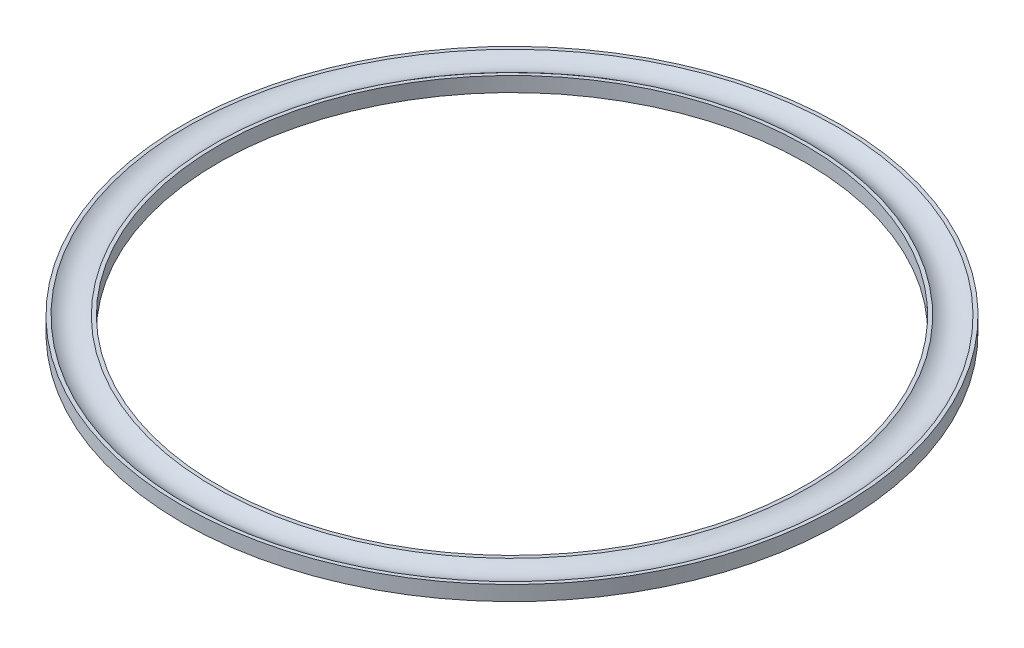
ISO-10303-21;
HEADER;
FILE_DESCRIPTION(('STEP AP214'),'2;1');
FILE_NAME('part.step','',(''),(''),'','','');
FILE_SCHEMA(('AUTOMOTIVE_DESIGN { 1 0 10303 214 1 1 1 1 }'));
ENDSEC;
DATA;
#1=APPLICATION_CONTEXT('core data for automotive mechanical design processes');
#2=APPLICATION_PROTOCOL_DEFINITION('international standard','automotive_design',2000,#1);
#3=PRODUCT_CONTEXT('',#1,'mechanical');
#4=PRODUCT('Part','Part','',(#3));
#5=PRODUCT_RELATED_PRODUCT_CATEGORY('part','',(#4));
#6=PRODUCT_DEFINITION_FORMATION('','',#4);
#7=PRODUCT_DEFINITION_CONTEXT('part definition',#1,'design');
#8=PRODUCT_DEFINITION('design','',#6,#7);
#9=PRODUCT_DEFINITION_SHAPE('','',#8);
#10=(LENGTH_UNIT() NAMED_UNIT(*) SI_UNIT(.MILLI.,.METRE.));
#11=(NAMED_UNIT(*) PLANE_ANGLE_UNIT() SI_UNIT($,.RADIAN.));
#12=(NAMED_UNIT(*) SI_UNIT($,.STERADIAN.) SOLID_ANGLE_UNIT());
#13=UNCERTAINTY_MEASURE_WITH_UNIT(LENGTH_MEASURE(1.E-05),#10,'distance_accuracy_value','');
#14=(GEOMETRIC_REPRESENTATION_CONTEXT(3) GLOBAL_UNCERTAINTY_ASSIGNED_CONTEXT((#13)) GLOBAL_UNIT_ASSIGNED_CONTEXT((#10,
#11,#12)) REPRESENTATION_CONTEXT('',''));
#15=CARTESIAN_POINT('',(0.,0.,0.));
#16=DIRECTION('',(0.,0.,1.));
#17=DIRECTION('',(1.,0.,0.));
#18=AXIS2_PLACEMENT_3D('',#15,#16,#17);
#19=CARTESIAN_POINT('',(42.9768,0.965200000000041,0.));
#20=DIRECTION('',(0.,1.,0.));
#21=DIRECTION('',(0.,0.,1.));
#22=AXIS2_PLACEMENT_3D('',#19,#20,#21);
#23=PLANE('',#22);
#24=CARTESIAN_POINT('',(0.,0.965199999999999,0.));
#25=DIRECTION('',(0.,-1.,0.));
#26=DIRECTION('',(0.,0.,-1.));
#27=AXIS2_PLACEMENT_3D('',#24,#25,#26);
#28=CIRCLE('',#27,42.51198);
#29=CARTESIAN_POINT('',(0.,0.965199999999999,-42.51198));
#30=VERTEX_POINT('',#29);
#31=EDGE_CURVE('E10',#30,#30,#28,.T.);
#32=ORIENTED_EDGE('',*,*,#31,.T.);
#33=EDGE_LOOP('',(#32));
#34=FACE_BOUND('',#33,.T.);
#35=CARTESIAN_POINT('',(0.,0.965199999999999,0.));
#36=DIRECTION('',(0.,-1.,0.));
#37=DIRECTION('',(0.,0.,-1.));
#38=AXIS2_PLACEMENT_3D('',#35,#36,#37);
#39=CIRCLE('',#38,42.9768);
#40=CARTESIAN_POINT('',(0.,0.965199999999999,-42.9768));
#41=VERTEX_POINT('',#40);
#42=EDGE_CURVE('E50',#41,#41,#39,.T.);
#43=ORIENTED_EDGE('',*,*,#42,.F.);
#44=EDGE_LOOP('',(#43));
#45=FACE_BOUND('',#44,.T.);
#46=ADVANCED_FACE('F28',(#34,#45),#23,.T.);
#47=CARTESIAN_POINT('',(0.,3.22977480916031,0.));
#48=DIRECTION('',(0.,-1.,0.));
#49=DIRECTION('',(0.,0.,-1.));
#50=AXIS2_PLACEMENT_3D('',#47,#48,#49);
#51=TOROIDAL_SURFACE('',#50,40.6527,2.93005480916032);
#52=CARTESIAN_POINT('',(0.,0.965199999999999,0.));
#53=DIRECTION('',(0.,-1.,0.));
#54=DIRECTION('',(0.,0.,-1.));
#55=AXIS2_PLACEMENT_3D('',#52,#53,#54);
#56=CIRCLE('',#55,38.79342);
#57=CARTESIAN_POINT('',(0.,0.965199999999999,-38.79342));
#58=VERTEX_POINT('',#57);
#59=EDGE_CURVE('E34',#58,#58,#56,.T.);
#60=ORIENTED_EDGE('',*,*,#59,.T.);
#61=EDGE_LOOP('',(#60));
#62=FACE_BOUND('',#61,.T.);
#63=ORIENTED_EDGE('',*,*,#31,.F.);
#64=EDGE_LOOP('',(#63));
#65=FACE_BOUND('',#64,.T.);
#66=ADVANCED_FACE('F58',(#62,#65),#51,.F.);
#67=CARTESIAN_POINT('',(38.3285999999999,0.965200000000041,0.));
#68=DIRECTION('',(0.,1.,0.));
#69=DIRECTION('',(0.,0.,1.));
#70=AXIS2_PLACEMENT_3D('',#67,#68,#69);
#71=PLANE('',#70);
#72=CARTESIAN_POINT('',(0.,0.965199999999999,0.));
#73=DIRECTION('',(0.,-1.,0.));
#74=DIRECTION('',(0.,0.,-1.));
#75=AXIS2_PLACEMENT_3D('',#72,#73,#74);
#76=CIRCLE('',#75,38.3286);
#77=CARTESIAN_POINT('',(0.,0.965199999999999,-38.3286));
#78=VERTEX_POINT('',#77);
#79=EDGE_CURVE('E38',#78,#78,#76,.T.);
#80=ORIENTED_EDGE('',*,*,#79,.T.);
#81=EDGE_LOOP('',(#80));
#82=FACE_BOUND('',#81,.T.);
#83=ORIENTED_EDGE('',*,*,#59,.F.);
#84=EDGE_LOOP('',(#83));
#85=FACE_BOUND('',#84,.T.);
#86=ADVANCED_FACE('F62',(#82,#85),#71,.T.);
#87=CARTESIAN_POINT('',(0.,-11.4126253664222,0.));
#88=DIRECTION('',(0.,-1.,0.));
#89=DIRECTION('',(0.,0.,-1.));
#90=AXIS2_PLACEMENT_3D('',#87,#88,#89);
#91=CYLINDRICAL_SURFACE('',#90,38.3286);
#92=CARTESIAN_POINT('',(0.,-0.965199999999999,0.));
#93=DIRECTION('',(0.,-1.,0.));
#94=DIRECTION('',(0.,0.,-1.));
#95=AXIS2_PLACEMENT_3D('',#92,#93,#94);
#96=CIRCLE('',#95,38.3286);
#97=CARTESIAN_POINT('',(0.,-0.965199999999999,-38.3286));
#98=VERTEX_POINT('',#97);
#99=EDGE_CURVE('E42',#98,#98,#96,.T.);
#100=ORIENTED_EDGE('',*,*,#99,.T.);
#101=EDGE_LOOP('',(#100));
#102=FACE_BOUND('',#101,.T.);
#103=ORIENTED_EDGE('',*,*,#79,.F.);
#104=EDGE_LOOP('',(#103));
#105=FACE_BOUND('',#104,.T.);
#106=ADVANCED_FACE('F66',(#102,#105),#91,.F.);
#107=CARTESIAN_POINT('',(42.9767999999998,-0.965199999999958,0.));
#108=DIRECTION('',(0.,-1.,0.));
#109=DIRECTION('',(0.,0.,-1.));
#110=AXIS2_PLACEMENT_3D('',#107,#108,#109);
#111=PLANE('',#110);
#112=CARTESIAN_POINT('',(0.,-0.965199999999999,0.));
#113=DIRECTION('',(0.,-1.,0.));
#114=DIRECTION('',(0.,0.,-1.));
#115=AXIS2_PLACEMENT_3D('',#112,#113,#114);
#116=CIRCLE('',#115,42.9768);
#117=CARTESIAN_POINT('',(0.,-0.965199999999999,-42.9768));
#118=VERTEX_POINT('',#117);
#119=EDGE_CURVE('E47',#118,#118,#116,.T.);
#120=ORIENTED_EDGE('',*,*,#119,.T.);
#121=EDGE_LOOP('',(#120));
#122=FACE_BOUND('',#121,.T.);
#123=ORIENTED_EDGE('',*,*,#99,.F.);
#124=EDGE_LOOP('',(#123));
#125=FACE_BOUND('',#124,.T.);
#126=ADVANCED_FACE('F73',(#122,#125),#111,.T.);
#127=CARTESIAN_POINT('',(0.,-11.4126253664222,0.));
#128=DIRECTION('',(0.,-1.,0.));
#129=DIRECTION('',(0.,0.,-1.));
#130=AXIS2_PLACEMENT_3D('',#127,#128,#129);
#131=CYLINDRICAL_SURFACE('',#130,42.9768);
#132=ORIENTED_EDGE('',*,*,#42,.T.);
#133=EDGE_LOOP('',(#132));
#134=FACE_BOUND('',#133,.T.);
#135=ORIENTED_EDGE('',*,*,#119,.F.);
#136=EDGE_LOOP('',(#135));
#137=FACE_BOUND('',#136,.T.);
#138=ADVANCED_FACE('F54',(#134,#137),#131,.T.);
#139=CLOSED_SHELL('',(#46,#66,#86,#106,#126,#138));
#140=MANIFOLD_SOLID_BREP('B2',#139);
#141=ADVANCED_BREP_SHAPE_REPRESENTATION('',(#18,#140),#14);
#142=SHAPE_DEFINITION_REPRESENTATION(#9,#141);
ENDSEC;
END-ISO-10303-21;
